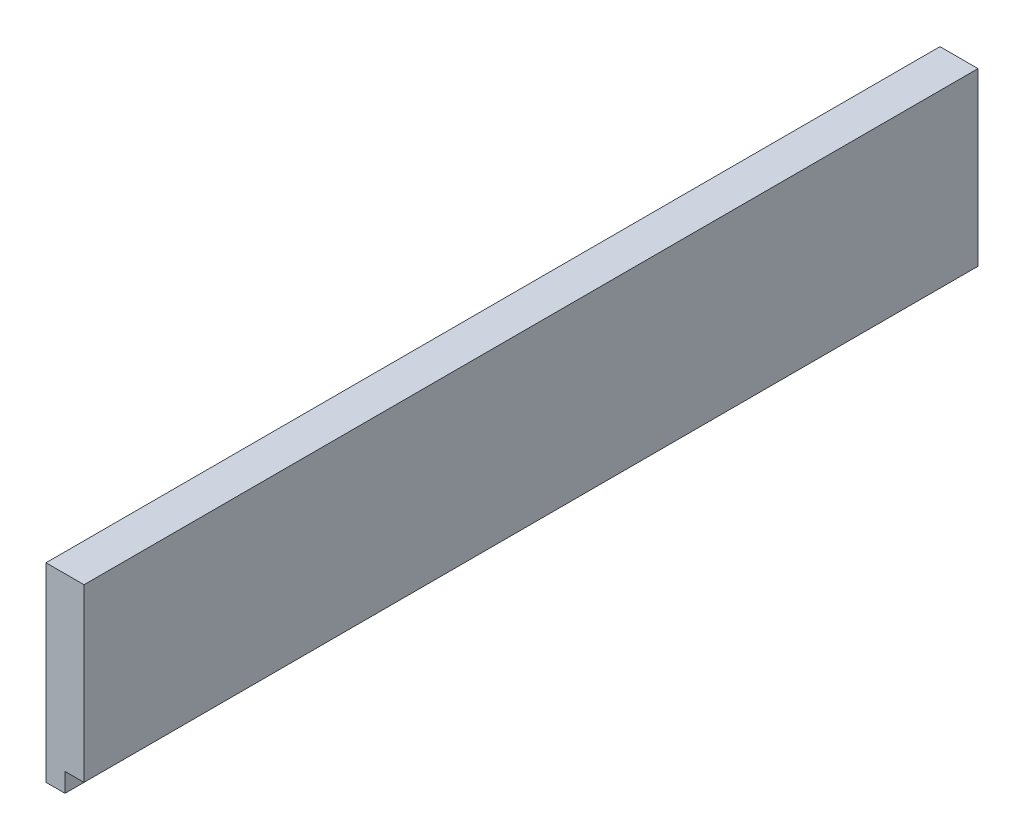
ISO-10303-21;
HEADER;
FILE_DESCRIPTION(('STEP AP214'),'2;1');
FILE_NAME('part.step','',(''),(''),'','','');
FILE_SCHEMA(('AUTOMOTIVE_DESIGN { 1 0 10303 214 1 1 1 1 }'));
ENDSEC;
DATA;
#1=APPLICATION_CONTEXT('core data for automotive mechanical design processes');
#2=APPLICATION_PROTOCOL_DEFINITION('international standard','automotive_design',2000,#1);
#3=PRODUCT_CONTEXT('',#1,'mechanical');
#4=PRODUCT('Part','Part','',(#3));
#5=PRODUCT_RELATED_PRODUCT_CATEGORY('part','',(#4));
#6=PRODUCT_DEFINITION_FORMATION('','',#4);
#7=PRODUCT_DEFINITION_CONTEXT('part definition',#1,'design');
#8=PRODUCT_DEFINITION('design','',#6,#7);
#9=PRODUCT_DEFINITION_SHAPE('','',#8);
#10=(LENGTH_UNIT() NAMED_UNIT(*) SI_UNIT(.MILLI.,.METRE.));
#11=(NAMED_UNIT(*) PLANE_ANGLE_UNIT() SI_UNIT($,.RADIAN.));
#12=(NAMED_UNIT(*) SI_UNIT($,.STERADIAN.) SOLID_ANGLE_UNIT());
#13=UNCERTAINTY_MEASURE_WITH_UNIT(LENGTH_MEASURE(1.E-05),#10,'distance_accuracy_value','');
#14=(GEOMETRIC_REPRESENTATION_CONTEXT(3) GLOBAL_UNCERTAINTY_ASSIGNED_CONTEXT((#13)) GLOBAL_UNIT_ASSIGNED_CONTEXT((#10,
#11,#12)) REPRESENTATION_CONTEXT('',''));
#15=CARTESIAN_POINT('',(0.,0.,0.));
#16=DIRECTION('',(0.,0.,1.));
#17=DIRECTION('',(1.,0.,0.));
#18=AXIS2_PLACEMENT_3D('',#15,#16,#17);
#19=CARTESIAN_POINT('',(10.,0.,470.));
#20=DIRECTION('',(0.,1.,0.));
#21=DIRECTION('',(-1.,0.,0.));
#22=AXIS2_PLACEMENT_3D('',#19,#20,#21);
#23=PLANE('',#22);
#24=DIRECTION('',(1.,0.,0.));
#25=VECTOR('',#24,1.);
#26=CARTESIAN_POINT('',(10.,0.,0.));
#27=LINE('',#26,#25);
#28=CARTESIAN_POINT('',(0.,0.,0.));
#29=VERTEX_POINT('',#28);
#30=CARTESIAN_POINT('',(10.,0.,0.));
#31=VERTEX_POINT('',#30);
#32=EDGE_CURVE('E119',#29,#31,#27,.T.);
#33=ORIENTED_EDGE('',*,*,#32,.T.);
#34=DIRECTION('',(0.,0.,-1.));
#35=VECTOR('',#34,1.);
#36=CARTESIAN_POINT('',(10.,0.,470.));
#37=LINE('',#36,#35);
#38=CARTESIAN_POINT('',(10.,0.,470.));
#39=VERTEX_POINT('',#38);
#40=EDGE_CURVE('E11',#39,#31,#37,.T.);
#41=ORIENTED_EDGE('',*,*,#40,.F.);
#42=DIRECTION('',(1.,0.,0.));
#43=VECTOR('',#42,1.);
#44=CARTESIAN_POINT('',(10.,0.,470.));
#45=LINE('',#44,#43);
#46=CARTESIAN_POINT('',(0.,0.,470.));
#47=VERTEX_POINT('',#46);
#48=EDGE_CURVE('E129',#47,#39,#45,.T.);
#49=ORIENTED_EDGE('',*,*,#48,.F.);
#50=DIRECTION('',(0.,0.,-1.));
#51=VECTOR('',#50,1.);
#52=CARTESIAN_POINT('',(0.,0.,470.));
#53=LINE('',#52,#51);
#54=EDGE_CURVE('E115',#47,#29,#53,.T.);
#55=ORIENTED_EDGE('',*,*,#54,.T.);
#56=EDGE_LOOP('',(#33,#41,#49,#55));
#57=FACE_BOUND('',#56,.T.);
#58=ADVANCED_FACE('F35',(#57),#23,.F.);
#59=CARTESIAN_POINT('',(10.,10.,470.));
#60=DIRECTION('',(-1.,0.,0.));
#61=DIRECTION('',(0.,-1.,0.));
#62=AXIS2_PLACEMENT_3D('',#59,#60,#61);
#63=PLANE('',#62);
#64=DIRECTION('',(0.,1.,0.));
#65=VECTOR('',#64,1.);
#66=CARTESIAN_POINT('',(10.,10.,0.));
#67=LINE('',#66,#65);
#68=CARTESIAN_POINT('',(10.,10.,0.));
#69=VERTEX_POINT('',#68);
#70=EDGE_CURVE('E122',#31,#69,#67,.T.);
#71=ORIENTED_EDGE('',*,*,#70,.T.);
#72=DIRECTION('',(0.,0.,-1.));
#73=VECTOR('',#72,1.);
#74=CARTESIAN_POINT('',(10.,10.,470.));
#75=LINE('',#74,#73);
#76=CARTESIAN_POINT('',(10.,10.,470.));
#77=VERTEX_POINT('',#76);
#78=EDGE_CURVE('E43',#77,#69,#75,.T.);
#79=ORIENTED_EDGE('',*,*,#78,.F.);
#80=DIRECTION('',(0.,1.,0.));
#81=VECTOR('',#80,1.);
#82=CARTESIAN_POINT('',(10.,10.,470.));
#83=LINE('',#82,#81);
#84=EDGE_CURVE('E88',#39,#77,#83,.T.);
#85=ORIENTED_EDGE('',*,*,#84,.F.);
#86=ORIENTED_EDGE('',*,*,#40,.T.);
#87=EDGE_LOOP('',(#71,#79,#85,#86));
#88=FACE_BOUND('',#87,.T.);
#89=ADVANCED_FACE('F153',(#88),#63,.F.);
#90=CARTESIAN_POINT('',(20.,10.,470.));
#91=DIRECTION('',(0.,1.,0.));
#92=DIRECTION('',(0.,0.,1.));
#93=AXIS2_PLACEMENT_3D('',#90,#91,#92);
#94=PLANE('',#93);
#95=DIRECTION('',(1.,0.,0.));
#96=VECTOR('',#95,1.);
#97=CARTESIAN_POINT('',(20.,10.,0.));
#98=LINE('',#97,#96);
#99=CARTESIAN_POINT('',(20.,10.,0.));
#100=VERTEX_POINT('',#99);
#101=EDGE_CURVE('E124',#69,#100,#98,.T.);
#102=ORIENTED_EDGE('',*,*,#101,.T.);
#103=DIRECTION('',(0.,0.,-1.));
#104=VECTOR('',#103,1.);
#105=CARTESIAN_POINT('',(20.,10.,470.));
#106=LINE('',#105,#104);
#107=CARTESIAN_POINT('',(20.,10.,470.));
#108=VERTEX_POINT('',#107);
#109=EDGE_CURVE('E110',#108,#100,#106,.T.);
#110=ORIENTED_EDGE('',*,*,#109,.F.);
#111=DIRECTION('',(1.,0.,0.));
#112=VECTOR('',#111,1.);
#113=CARTESIAN_POINT('',(20.,10.,470.));
#114=LINE('',#113,#112);
#115=EDGE_CURVE('E101',#77,#108,#114,.T.);
#116=ORIENTED_EDGE('',*,*,#115,.F.);
#117=ORIENTED_EDGE('',*,*,#78,.T.);
#118=EDGE_LOOP('',(#102,#110,#116,#117));
#119=FACE_BOUND('',#118,.T.);
#120=ADVANCED_FACE('F135',(#119),#94,.F.);
#121=CARTESIAN_POINT('',(20.,100.,470.));
#122=DIRECTION('',(-1.,0.,0.));
#123=DIRECTION('',(0.,-1.,0.));
#124=AXIS2_PLACEMENT_3D('',#121,#122,#123);
#125=PLANE('',#124);
#126=DIRECTION('',(0.,1.,0.));
#127=VECTOR('',#126,1.);
#128=CARTESIAN_POINT('',(20.,100.,0.));
#129=LINE('',#128,#127);
#130=CARTESIAN_POINT('',(20.,100.,0.));
#131=VERTEX_POINT('',#130);
#132=EDGE_CURVE('E109',#100,#131,#129,.T.);
#133=ORIENTED_EDGE('',*,*,#132,.T.);
#134=DIRECTION('',(0.,0.,-1.));
#135=VECTOR('',#134,1.);
#136=CARTESIAN_POINT('',(20.,100.,470.));
#137=LINE('',#136,#135);
#138=CARTESIAN_POINT('',(20.,100.,470.));
#139=VERTEX_POINT('',#138);
#140=EDGE_CURVE('E106',#139,#131,#137,.T.);
#141=ORIENTED_EDGE('',*,*,#140,.F.);
#142=DIRECTION('',(0.,1.,0.));
#143=VECTOR('',#142,1.);
#144=CARTESIAN_POINT('',(20.,100.,470.));
#145=LINE('',#144,#143);
#146=EDGE_CURVE('E95',#108,#139,#145,.T.);
#147=ORIENTED_EDGE('',*,*,#146,.F.);
#148=ORIENTED_EDGE('',*,*,#109,.T.);
#149=EDGE_LOOP('',(#133,#141,#147,#148));
#150=FACE_BOUND('',#149,.T.);
#151=ADVANCED_FACE('F107',(#150),#125,.F.);
#152=CARTESIAN_POINT('',(0.,100.,470.));
#153=DIRECTION('',(0.,-1.,0.));
#154=DIRECTION('',(0.,0.,-1.));
#155=AXIS2_PLACEMENT_3D('',#152,#153,#154);
#156=PLANE('',#155);
#157=DIRECTION('',(-1.,0.,0.));
#158=VECTOR('',#157,1.);
#159=CARTESIAN_POINT('',(0.,100.,0.));
#160=LINE('',#159,#158);
#161=CARTESIAN_POINT('',(0.,100.,0.));
#162=VERTEX_POINT('',#161);
#163=EDGE_CURVE('E74',#131,#162,#160,.T.);
#164=ORIENTED_EDGE('',*,*,#163,.T.);
#165=DIRECTION('',(0.,0.,-1.));
#166=VECTOR('',#165,1.);
#167=CARTESIAN_POINT('',(0.,100.,470.));
#168=LINE('',#167,#166);
#169=CARTESIAN_POINT('',(0.,100.,470.));
#170=VERTEX_POINT('',#169);
#171=EDGE_CURVE('E111',#170,#162,#168,.T.);
#172=ORIENTED_EDGE('',*,*,#171,.F.);
#173=DIRECTION('',(-1.,0.,0.));
#174=VECTOR('',#173,1.);
#175=CARTESIAN_POINT('',(0.,100.,470.));
#176=LINE('',#175,#174);
#177=EDGE_CURVE('E99',#139,#170,#176,.T.);
#178=ORIENTED_EDGE('',*,*,#177,.F.);
#179=ORIENTED_EDGE('',*,*,#140,.T.);
#180=EDGE_LOOP('',(#164,#172,#178,#179));
#181=FACE_BOUND('',#180,.T.);
#182=ADVANCED_FACE('F113',(#181),#156,.F.);
#183=CARTESIAN_POINT('',(0.,0.,470.));
#184=DIRECTION('',(1.,0.,0.));
#185=DIRECTION('',(0.,0.,-1.));
#186=AXIS2_PLACEMENT_3D('',#183,#184,#185);
#187=PLANE('',#186);
#188=DIRECTION('',(0.,-1.,0.));
#189=VECTOR('',#188,1.);
#190=CARTESIAN_POINT('',(0.,0.,0.));
#191=LINE('',#190,#189);
#192=EDGE_CURVE('E80',#162,#29,#191,.T.);
#193=ORIENTED_EDGE('',*,*,#192,.T.);
#194=ORIENTED_EDGE('',*,*,#54,.F.);
#195=DIRECTION('',(0.,-1.,0.));
#196=VECTOR('',#195,1.);
#197=CARTESIAN_POINT('',(0.,0.,470.));
#198=LINE('',#197,#196);
#199=EDGE_CURVE('E51',#170,#47,#198,.T.);
#200=ORIENTED_EDGE('',*,*,#199,.F.);
#201=ORIENTED_EDGE('',*,*,#171,.T.);
#202=EDGE_LOOP('',(#193,#194,#200,#201));
#203=FACE_BOUND('',#202,.T.);
#204=ADVANCED_FACE('F142',(#203),#187,.F.);
#205=CARTESIAN_POINT('',(0.,0.,470.));
#206=DIRECTION('',(0.,0.,-1.));
#207=DIRECTION('',(-1.,0.,0.));
#208=AXIS2_PLACEMENT_3D('',#205,#206,#207);
#209=PLANE('',#208);
#210=ORIENTED_EDGE('',*,*,#48,.T.);
#211=ORIENTED_EDGE('',*,*,#84,.T.);
#212=ORIENTED_EDGE('',*,*,#115,.T.);
#213=ORIENTED_EDGE('',*,*,#146,.T.);
#214=ORIENTED_EDGE('',*,*,#177,.T.);
#215=ORIENTED_EDGE('',*,*,#199,.T.);
#216=EDGE_LOOP('',(#210,#211,#212,#213,#214,#215));
#217=FACE_BOUND('',#216,.T.);
#218=ADVANCED_FACE('F97',(#217),#209,.F.);
#219=CARTESIAN_POINT('',(0.,0.,0.));
#220=DIRECTION('',(0.,0.,-1.));
#221=DIRECTION('',(-1.,0.,0.));
#222=AXIS2_PLACEMENT_3D('',#219,#220,#221);
#223=PLANE('',#222);
#224=ORIENTED_EDGE('',*,*,#32,.F.);
#225=ORIENTED_EDGE('',*,*,#192,.F.);
#226=ORIENTED_EDGE('',*,*,#163,.F.);
#227=ORIENTED_EDGE('',*,*,#132,.F.);
#228=ORIENTED_EDGE('',*,*,#101,.F.);
#229=ORIENTED_EDGE('',*,*,#70,.F.);
#230=EDGE_LOOP('',(#224,#225,#226,#227,#228,#229));
#231=FACE_BOUND('',#230,.T.);
#232=ADVANCED_FACE('F138',(#231),#223,.T.);
#233=CLOSED_SHELL('',(#58,#89,#120,#151,#182,#204,#218,#232));
#234=MANIFOLD_SOLID_BREP('B2',#233);
#235=ADVANCED_BREP_SHAPE_REPRESENTATION('',(#18,#234),#14);
#236=SHAPE_DEFINITION_REPRESENTATION(#9,#235);
ENDSEC;
END-ISO-10303-21;
